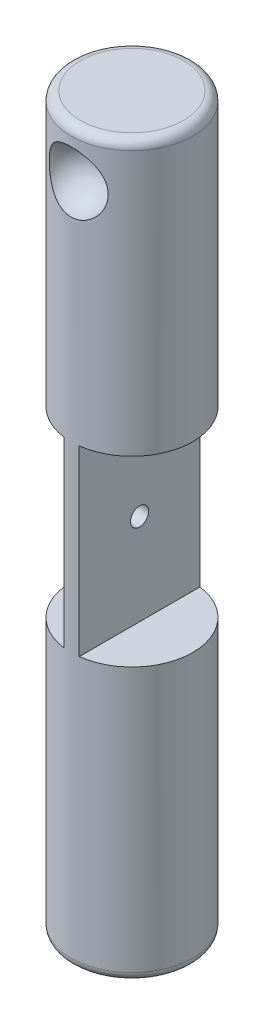
ISO-10303-21;
HEADER;
FILE_DESCRIPTION(('STEP AP214'),'2;1');
FILE_NAME('part.step','',(''),(''),'','','');
FILE_SCHEMA(('AUTOMOTIVE_DESIGN { 1 0 10303 214 1 1 1 1 }'));
ENDSEC;
DATA;
#1=APPLICATION_CONTEXT('core data for automotive mechanical design processes');
#2=APPLICATION_PROTOCOL_DEFINITION('international standard','automotive_design',2000,#1);
#3=PRODUCT_CONTEXT('',#1,'mechanical');
#4=PRODUCT('Part','Part','',(#3));
#5=PRODUCT_RELATED_PRODUCT_CATEGORY('part','',(#4));
#6=PRODUCT_DEFINITION_FORMATION('','',#4);
#7=PRODUCT_DEFINITION_CONTEXT('part definition',#1,'design');
#8=PRODUCT_DEFINITION('design','',#6,#7);
#9=PRODUCT_DEFINITION_SHAPE('','',#8);
#10=(LENGTH_UNIT() NAMED_UNIT(*) SI_UNIT(.MILLI.,.METRE.));
#11=(NAMED_UNIT(*) PLANE_ANGLE_UNIT() SI_UNIT($,.RADIAN.));
#12=(NAMED_UNIT(*) SI_UNIT($,.STERADIAN.) SOLID_ANGLE_UNIT());
#13=UNCERTAINTY_MEASURE_WITH_UNIT(LENGTH_MEASURE(1.E-05),#10,'distance_accuracy_value','');
#14=(GEOMETRIC_REPRESENTATION_CONTEXT(3) GLOBAL_UNCERTAINTY_ASSIGNED_CONTEXT((#13)) GLOBAL_UNIT_ASSIGNED_CONTEXT((#10,
#11,#12)) REPRESENTATION_CONTEXT('',''));
#15=CARTESIAN_POINT('',(0.,0.,0.));
#16=DIRECTION('',(0.,0.,1.));
#17=DIRECTION('',(1.,0.,0.));
#18=AXIS2_PLACEMENT_3D('',#15,#16,#17);
#19=CARTESIAN_POINT('',(0.,120.,0.));
#20=DIRECTION('',(0.,-1.,0.));
#21=DIRECTION('',(0.,0.,-1.));
#22=AXIS2_PLACEMENT_3D('',#19,#20,#21);
#23=CYLINDRICAL_SURFACE('',#22,20.);
#24=CARTESIAN_POINT('',(0.,-117.,0.));
#25=DIRECTION('',(0.,1.,0.));
#26=DIRECTION('',(0.,0.,1.));
#27=AXIS2_PLACEMENT_3D('',#24,#25,#26);
#28=CIRCLE('',#27,20.);
#29=CARTESIAN_POINT('',(0.,-117.,20.));
#30=VERTEX_POINT('',#29);
#31=EDGE_CURVE('E167',#30,#30,#28,.T.);
#32=ORIENTED_EDGE('',*,*,#31,.T.);
#33=EDGE_LOOP('',(#32));
#34=FACE_BOUND('',#33,.T.);
#35=CARTESIAN_POINT('',(0.,117.,0.));
#36=DIRECTION('',(0.,1.,0.));
#37=DIRECTION('',(0.,0.,1.));
#38=AXIS2_PLACEMENT_3D('',#35,#36,#37);
#39=CIRCLE('',#38,20.);
#40=CARTESIAN_POINT('',(0.,117.,20.));
#41=VERTEX_POINT('',#40);
#42=EDGE_CURVE('E106',#41,#41,#39,.F.);
#43=ORIENTED_EDGE('',*,*,#42,.T.);
#44=EDGE_LOOP('',(#43));
#45=FACE_BOUND('',#44,.T.);
#46=CARTESIAN_POINT('',(-9.68245836551857,104.,17.5));
#47=CARTESIAN_POINT('',(-9.68245794654495,104.275811277567,17.5000008594852));
#48=CARTESIAN_POINT('',(-9.67214212333224,104.551637407254,17.5057198987561));
#49=CARTESIAN_POINT('',(-9.63091264065548,105.101380675354,17.5284359607191));
#50=CARTESIAN_POINT('',(-9.5999906817259,105.375296999627,17.5454375276263));
#51=CARTESIAN_POINT('',(-9.51760283539055,105.919582665343,17.5902653699841));
#52=CARTESIAN_POINT('',(-9.46610363840549,106.189945518035,17.6181091945625));
#53=CARTESIAN_POINT('',(-9.34278107337283,106.724720306732,17.6838150575403));
#54=CARTESIAN_POINT('',(-9.27095970570167,106.989132825683,17.7216761098878));
#55=CARTESIAN_POINT('',(-9.10741958292828,107.509785285623,17.8062730959697));
#56=CARTESIAN_POINT('',(-9.0157333035361,107.766037791689,17.8529945291409));
#57=CARTESIAN_POINT('',(-8.81276908187781,108.269112157192,17.9540509046259));
#58=CARTESIAN_POINT('',(-8.70149067279217,108.515933791751,18.0083860283438));
#59=CARTESIAN_POINT('',(-8.45983504772356,108.998475991658,18.1231638902612));
#60=CARTESIAN_POINT('',(-8.32946273703947,109.234199387695,18.1836050585602));
#61=CARTESIAN_POINT('',(-8.0501493222154,109.693119837208,18.3089737596299));
#62=CARTESIAN_POINT('',(-7.90120804244816,109.916316772178,18.3739013348308));
#63=CARTESIAN_POINT('',(-7.58289861439502,110.352228316358,18.5075634967743));
#64=CARTESIAN_POINT('',(-7.41324337881563,110.564719881786,18.5763421955439));
#65=CARTESIAN_POINT('',(-7.05625434158473,110.973966947444,18.7148583177141));
#66=CARTESIAN_POINT('',(-6.86892028398158,111.17072221977,18.7845957549828));
#67=CARTESIAN_POINT('',(-6.47751907280843,111.547227153512,18.9231296669271));
#68=CARTESIAN_POINT('',(-6.27345058544567,111.72697545695,18.9919260660877));
#69=CARTESIAN_POINT('',(-5.84972559754839,112.068244685233,19.1266861756649));
#70=CARTESIAN_POINT('',(-5.63006933606126,112.229765889503,19.1926499294968));
#71=CARTESIAN_POINT('',(-5.17829667198062,112.532253131179,19.3194160745345));
#72=CARTESIAN_POINT('',(-4.94629355268719,112.67337275944,19.3802554176999));
#73=CARTESIAN_POINT('',(-4.46973228935537,112.935572101888,19.4956813213965));
#74=CARTESIAN_POINT('',(-4.22517411474387,113.056651767273,19.5502678667003));
#75=CARTESIAN_POINT('',(-3.72527069135167,113.277837415165,19.6516508031008));
#76=CARTESIAN_POINT('',(-3.46992837305077,113.377949052011,19.6984492936604));
#77=CARTESIAN_POINT('',(-2.95030283330128,113.556455643415,19.7829467209083));
#78=CARTESIAN_POINT('',(-2.68602007204235,113.634851713832,19.820646125142));
#79=CARTESIAN_POINT('',(-2.1644734175935,113.765812945555,19.8841760837146));
#80=CARTESIAN_POINT('',(-1.90755465662207,113.819505423141,19.910520121847));
#81=CARTESIAN_POINT('',(-1.38946564470252,113.9063945809,19.9533690152342));
#82=CARTESIAN_POINT('',(-1.1282955394017,113.939591961708,19.9698742068334));
#83=CARTESIAN_POINT('',(-0.603763137984569,113.985230876778,19.9926078574835));
#84=CARTESIAN_POINT('',(-0.340401351957254,113.997677111965,19.998838644075));
#85=CARTESIAN_POINT('',(0.186520635748563,114.00173089538,20.0008653638983));
#86=CARTESIAN_POINT('',(0.450080832950611,113.993338900451,19.996661525891));
#87=CARTESIAN_POINT('',(0.964500171487261,113.956559650197,19.9783191098283));
#88=CARTESIAN_POINT('',(1.21543475993958,113.929011495543,19.9645975011801));
#89=CARTESIAN_POINT('',(1.71381719816808,113.855021158831,19.9280018496536));
#90=CARTESIAN_POINT('',(1.96126516660624,113.808579621397,19.9051281190369));
#91=CARTESIAN_POINT('',(2.45096864881398,113.697127535246,19.8507795269704));
#92=CARTESIAN_POINT('',(2.69322427054061,113.632117373004,19.8193048445353));
#93=CARTESIAN_POINT('',(3.17094724587325,113.483967560539,19.7485039452676));
#94=CARTESIAN_POINT('',(3.40641446932643,113.400827562977,19.7091775780102));
#95=CARTESIAN_POINT('',(3.87130080163512,113.216076815839,19.6231865213101));
#96=CARTESIAN_POINT('',(4.10063984451238,113.114295925168,19.5764548194524));
#97=CARTESIAN_POINT('',(4.54958828300435,112.893414510939,19.4770156199196));
#98=CARTESIAN_POINT('',(4.7691934386376,112.774306534753,19.4243055530248));
#99=CARTESIAN_POINT('',(5.19731398751202,112.519543848994,19.3141602106574));
#100=CARTESIAN_POINT('',(5.40583009273343,112.383890203594,19.2567252391552));
#101=CARTESIAN_POINT('',(5.81069922864317,112.096826012207,19.1384498481782));
#102=CARTESIAN_POINT('',(6.00705164363848,111.945414669646,19.0776092566166));
#103=CARTESIAN_POINT('',(6.39615118621313,111.619725595046,18.9508098522134));
#104=CARTESIAN_POINT('',(6.58822381507694,111.444681961733,18.8847473702389));
#105=CARTESIAN_POINT('',(6.95693332750826,111.079229494147,18.7520526795026));
#106=CARTESIAN_POINT('',(7.13356975533766,110.888820206536,18.6854204539835));
#107=CARTESIAN_POINT('',(7.47062547556717,110.493722884411,18.5532352920862));
#108=CARTESIAN_POINT('',(7.63104097448967,110.289031528675,18.4876826111605));
#109=CARTESIAN_POINT('',(7.93490853707635,109.866616963796,18.3593147673524));
#110=CARTESIAN_POINT('',(8.07836047333879,109.648893656798,18.2964996250321));
#111=CARTESIAN_POINT('',(8.35362206625216,109.191877683068,18.1725282303822));
#112=CARTESIAN_POINT('',(8.48464465668687,108.952057769859,18.1115657157141));
#113=CARTESIAN_POINT('',(8.72698980110134,108.461175171387,17.9960462143823));
#114=CARTESIAN_POINT('',(8.83831174410331,108.210112137742,17.9414894263976));
#115=CARTESIAN_POINT('',(9.04077746682233,107.698432017373,17.8403239567629));
#116=CARTESIAN_POINT('',(9.13192171476215,107.437815152508,17.7937150906875));
#117=CARTESIAN_POINT('',(9.29364931298794,106.908821536684,17.709782375105));
#118=CARTESIAN_POINT('',(9.36423296480385,106.640444899588,17.6724583894325));
#119=CARTESIAN_POINT('',(9.48438781236802,106.098535005229,17.6082657356987));
#120=CARTESIAN_POINT('',(9.53401278195996,105.82501684846,17.5813703256851));
#121=CARTESIAN_POINT('',(9.61230345607895,105.274136999407,17.538689106449));
#122=CARTESIAN_POINT('',(9.64096913080854,104.996775301659,17.5229033130207));
#123=CARTESIAN_POINT('',(9.6772169099096,104.440293820286,17.5029112827272));
#124=CARTESIAN_POINT('',(9.6848014537298,104.161174243823,17.4987037060641));
#125=CARTESIAN_POINT('',(9.67886124267711,103.603231660936,17.501990101123));
#126=CARTESIAN_POINT('',(9.66533681729032,103.32440864995,17.5094838902004));
#127=CARTESIAN_POINT('',(9.61776242950604,102.775192056888,17.5356596273243));
#128=CARTESIAN_POINT('',(9.58416619908747,102.504747194279,17.5540941950894));
#129=CARTESIAN_POINT('',(9.49696880430984,101.968035879241,17.6014215454722));
#130=CARTESIAN_POINT('',(9.4433679518547,101.701769361731,17.6303141650321));
#131=CARTESIAN_POINT('',(9.31637417556484,101.175234906453,17.6977494008064));
#132=CARTESIAN_POINT('',(9.24298016832779,100.914967297889,17.7362925452457));
#133=CARTESIAN_POINT('',(9.07669526908893,100.402189566221,17.8219623594816));
#134=CARTESIAN_POINT('',(8.9838040975543,100.149679554397,17.8690891523416));
#135=CARTESIAN_POINT('',(8.77794941116249,99.6517715994763,17.9711133200715));
#136=CARTESIAN_POINT('',(8.66480818153598,99.4064610442899,18.0260785381311));
#137=CARTESIAN_POINT('',(8.41951364234981,98.9270035651548,18.1419452925868));
#138=CARTESIAN_POINT('',(8.28736024726199,98.6928566914335,18.2028468556877));
#139=CARTESIAN_POINT('',(8.00457856719452,98.2371682111437,18.3289575024811));
#140=CARTESIAN_POINT('',(7.85394742488878,98.0156285618804,18.3941672516533));
#141=CARTESIAN_POINT('',(7.53489140712156,97.5865752796306,18.5271496183286));
#142=CARTESIAN_POINT('',(7.36646652371463,97.3790616529071,18.5949222369761));
#143=CARTESIAN_POINT('',(7.00898579450399,96.9752635174319,18.7326330700467));
#144=CARTESIAN_POINT('',(6.81957866562277,96.7792951623848,18.8025872363467));
#145=CARTESIAN_POINT('',(6.42402965542121,96.4045939641958,18.9413770313235));
#146=CARTESIAN_POINT('',(6.21788746450822,96.2258614400444,19.010212639279));
#147=CARTESIAN_POINT('',(5.7900387795803,95.88684939277,19.1448618242543));
#148=CARTESIAN_POINT('',(5.56833312894197,95.7265688709823,19.2106755647085));
#149=CARTESIAN_POINT('',(5.11070313254827,95.4255751026921,19.3374525938319));
#150=CARTESIAN_POINT('',(4.87477921371109,95.2848612690988,19.3984160280093));
#151=CARTESIAN_POINT('',(4.39572755773678,95.0269620581789,19.5124787931178));
#152=CARTESIAN_POINT('',(4.15288137246843,94.9093184985246,19.5657242121024));
#153=CARTESIAN_POINT('',(3.65675089897155,94.6945658140453,19.6644891926863));
#154=CARTESIAN_POINT('',(3.40346669334637,94.5974565267555,19.7100088154107));
#155=CARTESIAN_POINT('',(2.88839169340528,94.4245411823803,19.7920483215262));
#156=CARTESIAN_POINT('',(2.62660344579103,94.3487288119482,19.828570871651));
#157=CARTESIAN_POINT('',(2.09648394364899,94.2189747591717,19.891605934521));
#158=CARTESIAN_POINT('',(1.82815301265798,94.1650319976875,19.9181189411752));
#159=CARTESIAN_POINT('',(1.30208185329219,94.0818211042808,19.9592161337212));
#160=CARTESIAN_POINT('',(1.04457569269696,94.0513542575191,19.9743785049417));
#161=CARTESIAN_POINT('',(0.527584794349635,94.0105576671606,19.9947134462622));
#162=CARTESIAN_POINT('',(0.268100134653897,94.0002271332243,19.9998864084409));
#163=CARTESIAN_POINT('',(-0.250845118786724,93.9997803101391,20.0001098698738));
#164=CARTESIAN_POINT('',(-0.510305709117306,94.0096605828495,19.9951620908075));
#165=CARTESIAN_POINT('',(-1.02728677082812,94.0495536908598,19.9752746013988));
#166=CARTESIAN_POINT('',(-1.28480725916562,94.0795663499877,19.9603349784917));
#167=CARTESIAN_POINT('',(-1.78852740047485,94.1583312819902,19.9214236241521));
#168=CARTESIAN_POINT('',(-2.03483819085557,94.2065115488078,19.8977279910933));
#169=CARTESIAN_POINT('',(-2.52213534763123,94.3212987409448,19.8418491602751));
#170=CARTESIAN_POINT('',(-2.76312185443461,94.3879051797137,19.8096661866285));
#171=CARTESIAN_POINT('',(-3.2382025054855,94.5391004741281,19.7375727299832));
#172=CARTESIAN_POINT('',(-3.47229637820773,94.6236900371165,19.6976619430265));
#173=CARTESIAN_POINT('',(-3.93212688931311,94.8103025488614,19.6110459481763));
#174=CARTESIAN_POINT('',(-4.15786331402058,94.9123259429764,19.564340566715));
#175=CARTESIAN_POINT('',(-4.60488375319681,95.135786966821,19.4640374763326));
#176=CARTESIAN_POINT('',(-4.82593573860887,95.2576271322119,19.4103027418406));
#177=CARTESIAN_POINT('',(-5.25670952680285,95.5182027849726,19.2980976961803));
#178=CARTESIAN_POINT('',(-5.46642633913768,95.6569456278768,19.2396253270704));
#179=CARTESIAN_POINT('',(-5.87333362069908,95.9504696725786,19.1193350870925));
#180=CARTESIAN_POINT('',(-6.07052258083337,96.1052528006861,19.0575168148351));
#181=CARTESIAN_POINT('',(-6.45129875995706,96.4298844594752,18.9320079296109));
#182=CARTESIAN_POINT('',(-6.63489093456111,96.5997274512081,18.8683180107422));
#183=CARTESIAN_POINT('',(-6.99724250969678,96.9631345488693,18.7370677826147));
#184=CARTESIAN_POINT('',(-7.17520626741071,97.1574841839591,18.6694841089482));
#185=CARTESIAN_POINT('',(-7.51433737233322,97.5607358334048,18.5355868849093));
#186=CARTESIAN_POINT('',(-7.67550405645605,97.7696384217142,18.4692733847627));
#187=CARTESIAN_POINT('',(-7.98037094264087,98.2008011025632,18.3396056803192));
#188=CARTESIAN_POINT('',(-8.12406519575767,98.423065706272,18.2762524884317));
#189=CARTESIAN_POINT('',(-8.39337247957248,98.8796342171678,18.1541503731287));
#190=CARTESIAN_POINT('',(-8.51897741927553,99.113943448493,18.0954035153547));
#191=CARTESIAN_POINT('',(-8.75545928547108,99.6011888414413,17.9822052803978));
#192=CARTESIAN_POINT('',(-8.8656929606065,99.854487141238,17.9279668990197));
#193=CARTESIAN_POINT('',(-9.06568240995107,100.370476922339,17.827672898386));
#194=CARTESIAN_POINT('',(-9.15544731036782,100.633164156823,17.781613634424));
#195=CARTESIAN_POINT('',(-9.31406722160617,101.165821937238,17.6990435318299));
#196=CARTESIAN_POINT('',(-9.38295210517985,101.435781470482,17.6625190623875));
#197=CARTESIAN_POINT('',(-9.49966818833654,101.981303150686,17.6000198543361));
#198=CARTESIAN_POINT('',(-9.54750847237218,102.256862826348,17.5740405639991));
#199=CARTESIAN_POINT('',(-9.61727814033193,102.776666882953,17.5359435971788));
#200=CARTESIAN_POINT('',(-9.64171318335062,103.02048111001,17.5224915944238));
#201=CARTESIAN_POINT('',(-9.67430353800969,103.509526304114,17.5045193831082));
#202=CARTESIAN_POINT('',(-9.68245873805674,103.75475728086,17.4999992357728));
#203=CARTESIAN_POINT('',(-9.68245836551857,104.,17.5));
#204=B_SPLINE_CURVE_WITH_KNOTS('',3,(#46,#47,#48,#49,#50,#51,#52,#53,#54,#55,#56,#57,#58,#59,
#60,#61,#62,#63,#64,#65,#66,#67,#68,#69,#70,#71,#72,#73,#74,#75,#76,#77,#78,#79,#80,#81,#82,#83,
#84,#85,#86,#87,#88,#89,#90,#91,#92,#93,#94,#95,#96,#97,#98,#99,#100,#101,#102,#103,#104,#105,
#106,#107,#108,#109,#110,#111,#112,#113,#114,#115,#116,#117,#118,#119,#120,#121,#122,#123,#124,
#125,#126,#127,#128,#129,#130,#131,#132,#133,#134,#135,#136,#137,#138,#139,#140,#141,#142,#143,
#144,#145,#146,#147,#148,#149,#150,#151,#152,#153,#154,#155,#156,#157,#158,#159,#160,#161,#162,
#163,#164,#165,#166,#167,#168,#169,#170,#171,#172,#173,#174,#175,#176,#177,#178,#179,#180,#181,
#182,#183,#184,#185,#186,#187,#188,#189,#190,#191,#192,#193,#194,#195,#196,#197,#198,#199,#200,
#201,#202,#203),.UNSPECIFIED.,.T.,.F.,(4,2,2,2,2,2,2,2,2,2,2,2,2,2,2,2,2,2,2,2,2,2,2,2,2,2,2,2,
2,2,2,2,2,2,2,2,2,2,2,2,2,2,2,2,2,2,2,2,2,2,2,2,2,2,2,2,2,2,2,2,2,2,2,2,2,2,2,2,2,2,2,2,2,2,2,2,
2,2,4),(0.,0.827208381112428,1.65475013575546,2.48363694322638,3.31244218907601,
4.13990256959816,4.96738266859687,5.79465055637332,6.62192626912952,7.46235323671405,
8.30279237375566,9.14329856197416,9.98379186333626,10.817585210819,11.6513805887884,
12.4849508312029,13.3184782325092,14.1088462968957,14.8991873407231,15.6893493178611,
16.4794939722398,17.2370445227509,17.9945692285628,18.7520781689359,19.5096016232559,
20.2744190359364,21.0395663854765,21.8046645487376,22.5698014076032,23.3733053744945,
24.1768330560132,24.9805482205442,25.7842694208473,26.6232576694368,27.4622719330797,
28.3012667253823,29.1402492128483,29.9770658439504,30.8138836647374,31.6506046473055,
32.4873125697772,33.3057862857019,34.1242472408506,34.9427530045481,35.7612705040472,
36.5873590047531,37.4134512218183,38.2396713439474,39.0658918350101,39.9089974506571,
40.7521186670121,41.5951942302386,42.4382444918506,43.2623247282876,44.0863984444533,
44.9102276103546,45.7340161200587,46.5122856833269,47.2905246993208,48.0686313369885,
48.8467311657869,49.602140123028,50.3575291352947,51.1129478653053,51.8683858958596,
52.6417134970251,53.4153788372117,54.1891371963233,54.9626121418444,55.7778333467567,
56.5930867213781,57.4086168976391,58.2245107191469,59.0680501861017,59.9112128139514,
60.7531633842329,61.594750146979,62.3302727981656,63.065800491117),.UNSPECIFIED.);
#205=CARTESIAN_POINT('',(-9.68245836551857,104.,17.5));
#206=VERTEX_POINT('',#205);
#207=EDGE_CURVE('E110',#206,#206,#204,.T.);
#208=ORIENTED_EDGE('',*,*,#207,.T.);
#209=EDGE_LOOP('',(#208));
#210=FACE_BOUND('',#209,.T.);
#211=DIRECTION('',(0.,-1.,0.));
#212=VECTOR('',#211,1.);
#213=CARTESIAN_POINT('',(-2.49999999999998,120.,-19.8431348329844));
#214=LINE('',#213,#212);
#215=CARTESIAN_POINT('',(-2.49999999999998,-30.,-19.8431348329844));
#216=VERTEX_POINT('',#215);
#217=CARTESIAN_POINT('',(-2.49999999999998,30.,-19.8431348329844));
#218=VERTEX_POINT('',#217);
#219=EDGE_CURVE('E97',#216,#218,#214,.F.);
#220=ORIENTED_EDGE('',*,*,#219,.T.);
#221=CARTESIAN_POINT('',(0.,30.,0.));
#222=DIRECTION('',(0.,1.,0.));
#223=DIRECTION('',(0.,0.,1.));
#224=AXIS2_PLACEMENT_3D('',#221,#222,#223);
#225=CIRCLE('',#224,20.);
#226=CARTESIAN_POINT('',(-2.49999999999998,30.,19.8431348329844));
#227=VERTEX_POINT('',#226);
#228=EDGE_CURVE('E103',#218,#227,#225,.T.);
#229=ORIENTED_EDGE('',*,*,#228,.T.);
#230=DIRECTION('',(0.,-1.,0.));
#231=VECTOR('',#230,1.);
#232=CARTESIAN_POINT('',(-2.49999999999998,120.,19.8431348329844));
#233=LINE('',#232,#231);
#234=CARTESIAN_POINT('',(-2.49999999999998,-30.,19.8431348329844));
#235=VERTEX_POINT('',#234);
#236=EDGE_CURVE('E100',#227,#235,#233,.T.);
#237=ORIENTED_EDGE('',*,*,#236,.T.);
#238=CARTESIAN_POINT('',(0.,-30.,0.));
#239=DIRECTION('',(0.,-1.,0.));
#240=DIRECTION('',(0.,0.,-1.));
#241=AXIS2_PLACEMENT_3D('',#238,#239,#240);
#242=CIRCLE('',#241,20.);
#243=EDGE_CURVE('E94',#235,#216,#242,.T.);
#244=ORIENTED_EDGE('',*,*,#243,.T.);
#245=EDGE_LOOP('',(#220,#229,#237,#244));
#246=FACE_BOUND('',#245,.T.);
#247=DIRECTION('',(0.,-1.,0.));
#248=VECTOR('',#247,1.);
#249=CARTESIAN_POINT('',(2.50000000000002,120.,-19.8431348329844));
#250=LINE('',#249,#248);
#251=CARTESIAN_POINT('',(2.50000000000002,30.,-19.8431348329844));
#252=VERTEX_POINT('',#251);
#253=CARTESIAN_POINT('',(2.50000000000002,-30.,-19.8431348329844));
#254=VERTEX_POINT('',#253);
#255=EDGE_CURVE('E84',#252,#254,#250,.T.);
#256=ORIENTED_EDGE('',*,*,#255,.T.);
#257=CARTESIAN_POINT('',(0.,-30.,0.));
#258=DIRECTION('',(0.,-1.,0.));
#259=DIRECTION('',(1.,0.,0.));
#260=AXIS2_PLACEMENT_3D('',#257,#258,#259);
#261=CIRCLE('',#260,20.);
#262=CARTESIAN_POINT('',(2.50000000000002,-30.,19.8431348329844));
#263=VERTEX_POINT('',#262);
#264=EDGE_CURVE('E89',#254,#263,#261,.T.);
#265=ORIENTED_EDGE('',*,*,#264,.T.);
#266=DIRECTION('',(0.,-1.,0.));
#267=VECTOR('',#266,1.);
#268=CARTESIAN_POINT('',(2.50000000000002,120.,19.8431348329844));
#269=LINE('',#268,#267);
#270=CARTESIAN_POINT('',(2.50000000000002,30.,19.8431348329844));
#271=VERTEX_POINT('',#270);
#272=EDGE_CURVE('E77',#263,#271,#269,.F.);
#273=ORIENTED_EDGE('',*,*,#272,.T.);
#274=CARTESIAN_POINT('',(0.,30.,0.));
#275=DIRECTION('',(0.,1.,0.));
#276=DIRECTION('',(-1.,0.,0.));
#277=AXIS2_PLACEMENT_3D('',#274,#275,#276);
#278=CIRCLE('',#277,20.);
#279=EDGE_CURVE('E72',#271,#252,#278,.T.);
#280=ORIENTED_EDGE('',*,*,#279,.T.);
#281=EDGE_LOOP('',(#256,#265,#273,#280));
#282=FACE_BOUND('',#281,.T.);
#283=ADVANCED_FACE('F33',(#34,#45,#210,#246,#282),#23,.T.);
#284=CARTESIAN_POINT('',(0.,120.,0.));
#285=DIRECTION('',(0.,1.,0.));
#286=DIRECTION('',(0.,0.,1.));
#287=AXIS2_PLACEMENT_3D('',#284,#285,#286);
#288=PLANE('',#287);
#289=CARTESIAN_POINT('',(0.,120.,0.));
#290=DIRECTION('',(0.,1.,0.));
#291=DIRECTION('',(0.,0.,1.));
#292=AXIS2_PLACEMENT_3D('',#289,#290,#291);
#293=CIRCLE('',#292,17.);
#294=CARTESIAN_POINT('',(0.,120.,17.));
#295=VERTEX_POINT('',#294);
#296=EDGE_CURVE('E11',#295,#295,#293,.T.);
#297=ORIENTED_EDGE('',*,*,#296,.T.);
#298=EDGE_LOOP('',(#297));
#299=FACE_BOUND('',#298,.T.);
#300=ADVANCED_FACE('F152',(#299),#288,.T.);
#301=CARTESIAN_POINT('',(0.,-120.,0.));
#302=DIRECTION('',(0.,1.,0.));
#303=DIRECTION('',(0.,0.,1.));
#304=AXIS2_PLACEMENT_3D('',#301,#302,#303);
#305=PLANE('',#304);
#306=CARTESIAN_POINT('',(0.,-120.,0.));
#307=DIRECTION('',(0.,1.,0.));
#308=DIRECTION('',(0.,0.,1.));
#309=AXIS2_PLACEMENT_3D('',#306,#307,#308);
#310=CIRCLE('',#309,17.);
#311=CARTESIAN_POINT('',(0.,-120.,17.));
#312=VERTEX_POINT('',#311);
#313=EDGE_CURVE('E41',#312,#312,#310,.F.);
#314=ORIENTED_EDGE('',*,*,#313,.T.);
#315=EDGE_LOOP('',(#314));
#316=FACE_BOUND('',#315,.T.);
#317=ADVANCED_FACE('F145',(#316),#305,.F.);
#318=CARTESIAN_POINT('',(27.3900939511407,-30.,-20.));
#319=DIRECTION('',(0.,-1.,0.));
#320=DIRECTION('',(1.,0.,0.));
#321=AXIS2_PLACEMENT_3D('',#318,#319,#320);
#322=PLANE('',#321);
#323=DIRECTION('',(0.,0.,1.));
#324=VECTOR('',#323,1.);
#325=CARTESIAN_POINT('',(2.50000000000002,-30.,-20.));
#326=LINE('',#325,#324);
#327=EDGE_CURVE('E85',#254,#263,#326,.T.);
#328=ORIENTED_EDGE('',*,*,#327,.T.);
#329=ORIENTED_EDGE('',*,*,#264,.F.);
#330=EDGE_LOOP('',(#328,#329));
#331=FACE_BOUND('',#330,.T.);
#332=ADVANCED_FACE('F142',(#331),#322,.F.);
#333=CARTESIAN_POINT('',(2.50000000000002,30.,-20.));
#334=DIRECTION('',(-1.,0.,0.));
#335=DIRECTION('',(0.,0.,1.));
#336=AXIS2_PLACEMENT_3D('',#333,#334,#335);
#337=PLANE('',#336);
#338=CARTESIAN_POINT('',(2.50000000000002,0.,0.));
#339=DIRECTION('',(-1.,0.,0.));
#340=DIRECTION('',(0.,0.,1.));
#341=AXIS2_PLACEMENT_3D('',#338,#339,#340);
#342=CIRCLE('',#341,3.);
#343=CARTESIAN_POINT('',(2.50000000000002,0.,3.));
#344=VERTEX_POINT('',#343);
#345=EDGE_CURVE('E86',#344,#344,#342,.T.);
#346=ORIENTED_EDGE('',*,*,#345,.T.);
#347=EDGE_LOOP('',(#346));
#348=FACE_BOUND('',#347,.T.);
#349=DIRECTION('',(0.,0.,1.));
#350=VECTOR('',#349,1.);
#351=CARTESIAN_POINT('',(2.50000000000002,30.,-20.));
#352=LINE('',#351,#350);
#353=EDGE_CURVE('E54',#252,#271,#352,.T.);
#354=ORIENTED_EDGE('',*,*,#353,.T.);
#355=ORIENTED_EDGE('',*,*,#272,.F.);
#356=ORIENTED_EDGE('',*,*,#327,.F.);
#357=ORIENTED_EDGE('',*,*,#255,.F.);
#358=EDGE_LOOP('',(#354,#355,#356,#357));
#359=FACE_BOUND('',#358,.T.);
#360=ADVANCED_FACE('F81',(#348,#359),#337,.F.);
#361=CARTESIAN_POINT('',(27.3900939511407,30.,-20.));
#362=DIRECTION('',(0.,1.,0.));
#363=DIRECTION('',(-1.,0.,0.));
#364=AXIS2_PLACEMENT_3D('',#361,#362,#363);
#365=PLANE('',#364);
#366=ORIENTED_EDGE('',*,*,#353,.F.);
#367=ORIENTED_EDGE('',*,*,#279,.F.);
#368=EDGE_LOOP('',(#366,#367));
#369=FACE_BOUND('',#368,.T.);
#370=ADVANCED_FACE('F73',(#369),#365,.F.);
#371=CARTESIAN_POINT('',(-20.,30.,-20.));
#372=DIRECTION('',(0.,1.,0.));
#373=DIRECTION('',(0.,0.,1.));
#374=AXIS2_PLACEMENT_3D('',#371,#372,#373);
#375=PLANE('',#374);
#376=DIRECTION('',(0.,0.,1.));
#377=VECTOR('',#376,1.);
#378=CARTESIAN_POINT('',(-2.49999999999998,30.,-20.));
#379=LINE('',#378,#377);
#380=EDGE_CURVE('E78',#218,#227,#379,.T.);
#381=ORIENTED_EDGE('',*,*,#380,.T.);
#382=ORIENTED_EDGE('',*,*,#228,.F.);
#383=EDGE_LOOP('',(#381,#382));
#384=FACE_BOUND('',#383,.T.);
#385=ADVANCED_FACE('F132',(#384),#375,.F.);
#386=CARTESIAN_POINT('',(-2.49999999999998,30.,-20.));
#387=DIRECTION('',(1.,0.,0.));
#388=DIRECTION('',(0.,0.,-1.));
#389=AXIS2_PLACEMENT_3D('',#386,#387,#388);
#390=PLANE('',#389);
#391=CARTESIAN_POINT('',(-2.49999999999998,0.,0.));
#392=DIRECTION('',(1.,0.,0.));
#393=DIRECTION('',(0.,0.,-1.));
#394=AXIS2_PLACEMENT_3D('',#391,#392,#393);
#395=CIRCLE('',#394,3.);
#396=CARTESIAN_POINT('',(-2.49999999999998,0.,-3.));
#397=VERTEX_POINT('',#396);
#398=EDGE_CURVE('E107',#397,#397,#395,.T.);
#399=ORIENTED_EDGE('',*,*,#398,.T.);
#400=EDGE_LOOP('',(#399));
#401=FACE_BOUND('',#400,.T.);
#402=ORIENTED_EDGE('',*,*,#380,.F.);
#403=ORIENTED_EDGE('',*,*,#219,.F.);
#404=DIRECTION('',(0.,0.,1.));
#405=VECTOR('',#404,1.);
#406=CARTESIAN_POINT('',(-2.49999999999998,-30.,-20.));
#407=LINE('',#406,#405);
#408=EDGE_CURVE('E47',#216,#235,#407,.T.);
#409=ORIENTED_EDGE('',*,*,#408,.T.);
#410=ORIENTED_EDGE('',*,*,#236,.F.);
#411=EDGE_LOOP('',(#402,#403,#409,#410));
#412=FACE_BOUND('',#411,.T.);
#413=ADVANCED_FACE('F135',(#401,#412),#390,.F.);
#414=CARTESIAN_POINT('',(-20.,-30.,-20.));
#415=DIRECTION('',(0.,-1.,0.));
#416=DIRECTION('',(0.,0.,-1.));
#417=AXIS2_PLACEMENT_3D('',#414,#415,#416);
#418=PLANE('',#417);
#419=ORIENTED_EDGE('',*,*,#408,.F.);
#420=ORIENTED_EDGE('',*,*,#243,.F.);
#421=EDGE_LOOP('',(#419,#420));
#422=FACE_BOUND('',#421,.T.);
#423=ADVANCED_FACE('F130',(#422),#418,.F.);
#424=CARTESIAN_POINT('',(-20.,0.,0.));
#425=DIRECTION('',(1.,0.,0.));
#426=DIRECTION('',(0.,0.,-1.));
#427=AXIS2_PLACEMENT_3D('',#424,#425,#426);
#428=CYLINDRICAL_SURFACE('',#427,3.);
#429=ORIENTED_EDGE('',*,*,#398,.F.);
#430=EDGE_LOOP('',(#429));
#431=FACE_BOUND('',#430,.T.);
#432=ORIENTED_EDGE('',*,*,#345,.F.);
#433=EDGE_LOOP('',(#432));
#434=FACE_BOUND('',#433,.T.);
#435=ADVANCED_FACE('F126',(#431,#434),#428,.F.);
#436=CARTESIAN_POINT('',(0.,104.,20.));
#437=DIRECTION('',(0.,0.,1.));
#438=DIRECTION('',(0.,1.,0.));
#439=AXIS2_PLACEMENT_3D('',#436,#437,#438);
#440=SPHERICAL_SURFACE('',#439,10.);
#441=ORIENTED_EDGE('',*,*,#207,.F.);
#442=EDGE_LOOP('',(#441));
#443=FACE_BOUND('',#442,.T.);
#444=ADVANCED_FACE('F121',(#443),#440,.F.);
#445=CARTESIAN_POINT('',(0.,-117.,0.));
#446=DIRECTION('',(0.,1.,0.));
#447=DIRECTION('',(0.,0.,1.));
#448=AXIS2_PLACEMENT_3D('',#445,#446,#447);
#449=TOROIDAL_SURFACE('',#448,17.,3.);
#450=ORIENTED_EDGE('',*,*,#313,.F.);
#451=EDGE_LOOP('',(#450));
#452=FACE_BOUND('',#451,.T.);
#453=ORIENTED_EDGE('',*,*,#31,.F.);
#454=EDGE_LOOP('',(#453));
#455=FACE_BOUND('',#454,.T.);
#456=ADVANCED_FACE('F125',(#452,#455),#449,.T.);
#457=CARTESIAN_POINT('',(0.,117.,0.));
#458=DIRECTION('',(0.,1.,0.));
#459=DIRECTION('',(0.,0.,1.));
#460=AXIS2_PLACEMENT_3D('',#457,#458,#459);
#461=TOROIDAL_SURFACE('',#460,17.,3.);
#462=ORIENTED_EDGE('',*,*,#42,.F.);
#463=EDGE_LOOP('',(#462));
#464=FACE_BOUND('',#463,.T.);
#465=ORIENTED_EDGE('',*,*,#296,.F.);
#466=EDGE_LOOP('',(#465));
#467=FACE_BOUND('',#466,.T.);
#468=ADVANCED_FACE('F35',(#464,#467),#461,.T.);
#469=CLOSED_SHELL('',(#283,#300,#317,#332,#360,#370,#385,#413,#423,#435,#444,#456,#468));
#470=MANIFOLD_SOLID_BREP('B2',#469);
#471=ADVANCED_BREP_SHAPE_REPRESENTATION('',(#18,#470),#14);
#472=SHAPE_DEFINITION_REPRESENTATION(#9,#471);
ENDSEC;
END-ISO-10303-21;
